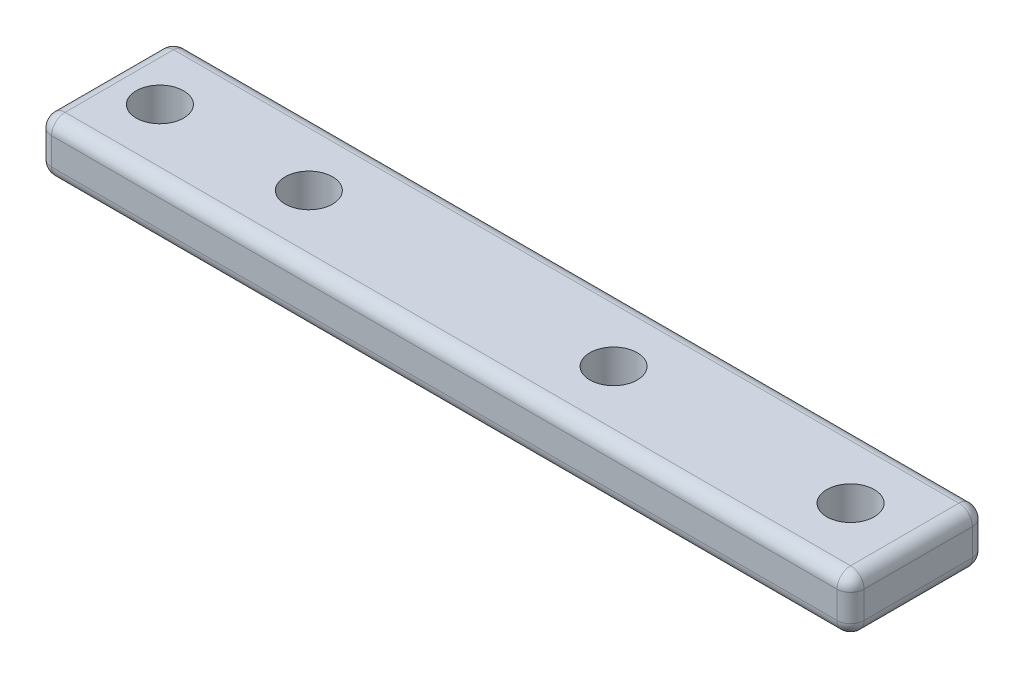
ISO-10303-21;
HEADER;
FILE_DESCRIPTION(('STEP AP214'),'2;1');
FILE_NAME('part.step','',(''),(''),'','','');
FILE_SCHEMA(('AUTOMOTIVE_DESIGN { 1 0 10303 214 1 1 1 1 }'));
ENDSEC;
DATA;
#1=APPLICATION_CONTEXT('core data for automotive mechanical design processes');
#2=APPLICATION_PROTOCOL_DEFINITION('international standard','automotive_design',2000,#1);
#3=PRODUCT_CONTEXT('',#1,'mechanical');
#4=PRODUCT('Part','Part','',(#3));
#5=PRODUCT_RELATED_PRODUCT_CATEGORY('part','',(#4));
#6=PRODUCT_DEFINITION_FORMATION('','',#4);
#7=PRODUCT_DEFINITION_CONTEXT('part definition',#1,'design');
#8=PRODUCT_DEFINITION('design','',#6,#7);
#9=PRODUCT_DEFINITION_SHAPE('','',#8);
#10=(LENGTH_UNIT() NAMED_UNIT(*) SI_UNIT(.MILLI.,.METRE.));
#11=(NAMED_UNIT(*) PLANE_ANGLE_UNIT() SI_UNIT($,.RADIAN.));
#12=(NAMED_UNIT(*) SI_UNIT($,.STERADIAN.) SOLID_ANGLE_UNIT());
#13=UNCERTAINTY_MEASURE_WITH_UNIT(LENGTH_MEASURE(1.E-05),#10,'distance_accuracy_value','');
#14=(GEOMETRIC_REPRESENTATION_CONTEXT(3) GLOBAL_UNCERTAINTY_ASSIGNED_CONTEXT((#13)) GLOBAL_UNIT_ASSIGNED_CONTEXT((#10,
#11,#12)) REPRESENTATION_CONTEXT('',''));
#15=CARTESIAN_POINT('',(0.,0.,0.));
#16=DIRECTION('',(0.,0.,1.));
#17=DIRECTION('',(1.,0.,0.));
#18=AXIS2_PLACEMENT_3D('',#15,#16,#17);
#19=CARTESIAN_POINT('',(30.,4.,-5.));
#20=DIRECTION('',(-1.,0.,0.));
#21=DIRECTION('',(0.,0.,1.));
#22=AXIS2_PLACEMENT_3D('',#19,#20,#21);
#23=PLANE('',#22);
#24=DIRECTION('',(0.,0.,-1.));
#25=VECTOR('',#24,1.);
#26=CARTESIAN_POINT('',(30.,1.,-5.));
#27=LINE('',#26,#25);
#28=CARTESIAN_POINT('',(30.,1.,4.));
#29=VERTEX_POINT('',#28);
#30=CARTESIAN_POINT('',(30.,1.,-4.));
#31=VERTEX_POINT('',#30);
#32=EDGE_CURVE('E178',#29,#31,#27,.T.);
#33=ORIENTED_EDGE('',*,*,#32,.T.);
#34=DIRECTION('',(0.,-1.,0.));
#35=VECTOR('',#34,1.);
#36=CARTESIAN_POINT('',(30.,4.,-4.));
#37=LINE('',#36,#35);
#38=CARTESIAN_POINT('',(30.,3.,-4.));
#39=VERTEX_POINT('',#38);
#40=EDGE_CURVE('E183',#31,#39,#37,.F.);
#41=ORIENTED_EDGE('',*,*,#40,.T.);
#42=DIRECTION('',(0.,0.,-1.));
#43=VECTOR('',#42,1.);
#44=CARTESIAN_POINT('',(30.,3.,5.));
#45=LINE('',#44,#43);
#46=CARTESIAN_POINT('',(30.,3.,4.));
#47=VERTEX_POINT('',#46);
#48=EDGE_CURVE('E180',#39,#47,#45,.F.);
#49=ORIENTED_EDGE('',*,*,#48,.T.);
#50=DIRECTION('',(0.,-1.,0.));
#51=VECTOR('',#50,1.);
#52=CARTESIAN_POINT('',(30.,4.,4.));
#53=LINE('',#52,#51);
#54=EDGE_CURVE('E176',#47,#29,#53,.T.);
#55=ORIENTED_EDGE('',*,*,#54,.T.);
#56=EDGE_LOOP('',(#33,#41,#49,#55));
#57=FACE_BOUND('',#56,.T.);
#58=ADVANCED_FACE('F39',(#57),#23,.F.);
#59=CARTESIAN_POINT('',(-30.,4.,-5.));
#60=DIRECTION('',(0.,0.,1.));
#61=DIRECTION('',(1.,0.,0.));
#62=AXIS2_PLACEMENT_3D('',#59,#60,#61);
#63=PLANE('',#62);
#64=DIRECTION('',(-1.,0.,0.));
#65=VECTOR('',#64,1.);
#66=CARTESIAN_POINT('',(30.,3.,-5.));
#67=LINE('',#66,#65);
#68=CARTESIAN_POINT('',(-29.,3.,-5.));
#69=VERTEX_POINT('',#68);
#70=CARTESIAN_POINT('',(29.,3.,-5.));
#71=VERTEX_POINT('',#70);
#72=EDGE_CURVE('E205',#69,#71,#67,.F.);
#73=ORIENTED_EDGE('',*,*,#72,.T.);
#74=DIRECTION('',(0.,-1.,0.));
#75=VECTOR('',#74,1.);
#76=CARTESIAN_POINT('',(29.,4.,-5.));
#77=LINE('',#76,#75);
#78=CARTESIAN_POINT('',(29.,1.,-5.));
#79=VERTEX_POINT('',#78);
#80=EDGE_CURVE('E207',#71,#79,#77,.T.);
#81=ORIENTED_EDGE('',*,*,#80,.T.);
#82=DIRECTION('',(-1.,0.,0.));
#83=VECTOR('',#82,1.);
#84=CARTESIAN_POINT('',(-30.,1.,-5.));
#85=LINE('',#84,#83);
#86=CARTESIAN_POINT('',(-29.,1.,-5.));
#87=VERTEX_POINT('',#86);
#88=EDGE_CURVE('E201',#79,#87,#85,.T.);
#89=ORIENTED_EDGE('',*,*,#88,.T.);
#90=DIRECTION('',(0.,-1.,0.));
#91=VECTOR('',#90,1.);
#92=CARTESIAN_POINT('',(-29.,4.,-5.));
#93=LINE('',#92,#91);
#94=EDGE_CURVE('E203',#87,#69,#93,.F.);
#95=ORIENTED_EDGE('',*,*,#94,.T.);
#96=EDGE_LOOP('',(#73,#81,#89,#95));
#97=FACE_BOUND('',#96,.T.);
#98=ADVANCED_FACE('F321',(#97),#63,.F.);
#99=CARTESIAN_POINT('',(-30.,4.,-5.));
#100=DIRECTION('',(1.,0.,0.));
#101=DIRECTION('',(0.,0.,-1.));
#102=AXIS2_PLACEMENT_3D('',#99,#100,#101);
#103=PLANE('',#102);
#104=DIRECTION('',(0.,0.,1.));
#105=VECTOR('',#104,1.);
#106=CARTESIAN_POINT('',(-30.,3.,-5.));
#107=LINE('',#106,#105);
#108=CARTESIAN_POINT('',(-30.,3.,4.));
#109=VERTEX_POINT('',#108);
#110=CARTESIAN_POINT('',(-30.,3.,-4.));
#111=VERTEX_POINT('',#110);
#112=EDGE_CURVE('E147',#109,#111,#107,.F.);
#113=ORIENTED_EDGE('',*,*,#112,.T.);
#114=DIRECTION('',(0.,-1.,0.));
#115=VECTOR('',#114,1.);
#116=CARTESIAN_POINT('',(-30.,4.,-4.));
#117=LINE('',#116,#115);
#118=CARTESIAN_POINT('',(-30.,1.,-4.));
#119=VERTEX_POINT('',#118);
#120=EDGE_CURVE('E199',#111,#119,#117,.T.);
#121=ORIENTED_EDGE('',*,*,#120,.T.);
#122=DIRECTION('',(0.,0.,1.));
#123=VECTOR('',#122,1.);
#124=CARTESIAN_POINT('',(-30.,1.,-5.));
#125=LINE('',#124,#123);
#126=CARTESIAN_POINT('',(-30.,1.,4.));
#127=VERTEX_POINT('',#126);
#128=EDGE_CURVE('E196',#119,#127,#125,.T.);
#129=ORIENTED_EDGE('',*,*,#128,.T.);
#130=DIRECTION('',(0.,-1.,0.));
#131=VECTOR('',#130,1.);
#132=CARTESIAN_POINT('',(-30.,4.,4.));
#133=LINE('',#132,#131);
#134=EDGE_CURVE('E194',#127,#109,#133,.F.);
#135=ORIENTED_EDGE('',*,*,#134,.T.);
#136=EDGE_LOOP('',(#113,#121,#129,#135));
#137=FACE_BOUND('',#136,.T.);
#138=ADVANCED_FACE('F328',(#137),#103,.F.);
#139=CARTESIAN_POINT('',(-30.,4.,5.));
#140=DIRECTION('',(0.,0.,-1.));
#141=DIRECTION('',(-1.,0.,0.));
#142=AXIS2_PLACEMENT_3D('',#139,#140,#141);
#143=PLANE('',#142);
#144=DIRECTION('',(1.,0.,0.));
#145=VECTOR('',#144,1.);
#146=CARTESIAN_POINT('',(-30.,3.,5.));
#147=LINE('',#146,#145);
#148=CARTESIAN_POINT('',(29.,3.,5.));
#149=VERTEX_POINT('',#148);
#150=CARTESIAN_POINT('',(-29.,3.,5.));
#151=VERTEX_POINT('',#150);
#152=EDGE_CURVE('E48',#149,#151,#147,.F.);
#153=ORIENTED_EDGE('',*,*,#152,.T.);
#154=DIRECTION('',(0.,-1.,0.));
#155=VECTOR('',#154,1.);
#156=CARTESIAN_POINT('',(-29.,4.,5.));
#157=LINE('',#156,#155);
#158=CARTESIAN_POINT('',(-29.,1.,5.));
#159=VERTEX_POINT('',#158);
#160=EDGE_CURVE('E11',#151,#159,#157,.T.);
#161=ORIENTED_EDGE('',*,*,#160,.T.);
#162=DIRECTION('',(1.,0.,0.));
#163=VECTOR('',#162,1.);
#164=CARTESIAN_POINT('',(-30.,1.,5.));
#165=LINE('',#164,#163);
#166=CARTESIAN_POINT('',(29.,1.,5.));
#167=VERTEX_POINT('',#166);
#168=EDGE_CURVE('E210',#159,#167,#165,.T.);
#169=ORIENTED_EDGE('',*,*,#168,.T.);
#170=DIRECTION('',(0.,-1.,0.));
#171=VECTOR('',#170,1.);
#172=CARTESIAN_POINT('',(29.,4.,5.));
#173=LINE('',#172,#171);
#174=EDGE_CURVE('E59',#167,#149,#173,.F.);
#175=ORIENTED_EDGE('',*,*,#174,.T.);
#176=EDGE_LOOP('',(#153,#161,#169,#175));
#177=FACE_BOUND('',#176,.T.);
#178=ADVANCED_FACE('F298',(#177),#143,.F.);
#179=CARTESIAN_POINT('',(0.,4.,0.));
#180=DIRECTION('',(0.,1.,0.));
#181=DIRECTION('',(0.,0.,1.));
#182=AXIS2_PLACEMENT_3D('',#179,#180,#181);
#183=PLANE('',#182);
#184=DIRECTION('',(0.,0.,-1.));
#185=VECTOR('',#184,1.);
#186=CARTESIAN_POINT('',(29.,4.,-5.));
#187=LINE('',#186,#185);
#188=CARTESIAN_POINT('',(29.,4.,4.));
#189=VERTEX_POINT('',#188);
#190=CARTESIAN_POINT('',(29.,4.,-4.));
#191=VERTEX_POINT('',#190);
#192=EDGE_CURVE('E139',#189,#191,#187,.T.);
#193=ORIENTED_EDGE('',*,*,#192,.T.);
#194=DIRECTION('',(-1.,0.,0.));
#195=VECTOR('',#194,1.);
#196=CARTESIAN_POINT('',(-30.,4.,-4.));
#197=LINE('',#196,#195);
#198=CARTESIAN_POINT('',(-29.,4.,-4.));
#199=VERTEX_POINT('',#198);
#200=EDGE_CURVE('E135',#191,#199,#197,.T.);
#201=ORIENTED_EDGE('',*,*,#200,.T.);
#202=DIRECTION('',(0.,0.,1.));
#203=VECTOR('',#202,1.);
#204=CARTESIAN_POINT('',(-29.,4.,5.));
#205=LINE('',#204,#203);
#206=CARTESIAN_POINT('',(-29.,4.,4.));
#207=VERTEX_POINT('',#206);
#208=EDGE_CURVE('E126',#199,#207,#205,.T.);
#209=ORIENTED_EDGE('',*,*,#208,.T.);
#210=DIRECTION('',(1.,0.,0.));
#211=VECTOR('',#210,1.);
#212=CARTESIAN_POINT('',(30.,4.,4.));
#213=LINE('',#212,#211);
#214=EDGE_CURVE('E132',#207,#189,#213,.T.);
#215=ORIENTED_EDGE('',*,*,#214,.T.);
#216=EDGE_LOOP('',(#193,#201,#209,#215));
#217=FACE_BOUND('',#216,.T.);
#218=CARTESIAN_POINT('',(-26.,4.,0.));
#219=DIRECTION('',(0.,1.,0.));
#220=DIRECTION('',(0.,0.,1.));
#221=AXIS2_PLACEMENT_3D('',#218,#219,#220);
#222=CIRCLE('',#221,1.75);
#223=CARTESIAN_POINT('',(-26.,4.,1.75));
#224=VERTEX_POINT('',#223);
#225=EDGE_CURVE('E168',#224,#224,#222,.T.);
#226=ORIENTED_EDGE('',*,*,#225,.F.);
#227=EDGE_LOOP('',(#226));
#228=FACE_BOUND('',#227,.T.);
#229=CARTESIAN_POINT('',(7.5,4.,0.));
#230=DIRECTION('',(0.,1.,0.));
#231=DIRECTION('',(0.,0.,1.));
#232=AXIS2_PLACEMENT_3D('',#229,#230,#231);
#233=CIRCLE('',#232,1.75);
#234=CARTESIAN_POINT('',(7.5,4.,1.75));
#235=VERTEX_POINT('',#234);
#236=EDGE_CURVE('E288',#235,#235,#233,.T.);
#237=ORIENTED_EDGE('',*,*,#236,.F.);
#238=EDGE_LOOP('',(#237));
#239=FACE_BOUND('',#238,.T.);
#240=CARTESIAN_POINT('',(25.,4.,0.));
#241=DIRECTION('',(0.,1.,0.));
#242=DIRECTION('',(0.,0.,1.));
#243=AXIS2_PLACEMENT_3D('',#240,#241,#242);
#244=CIRCLE('',#243,1.75);
#245=CARTESIAN_POINT('',(25.,4.,1.75));
#246=VERTEX_POINT('',#245);
#247=EDGE_CURVE('E280',#246,#246,#244,.T.);
#248=ORIENTED_EDGE('',*,*,#247,.F.);
#249=EDGE_LOOP('',(#248));
#250=FACE_BOUND('',#249,.T.);
#251=CARTESIAN_POINT('',(-15.,4.,0.));
#252=DIRECTION('',(0.,1.,0.));
#253=DIRECTION('',(0.,0.,1.));
#254=AXIS2_PLACEMENT_3D('',#251,#252,#253);
#255=CIRCLE('',#254,1.75);
#256=CARTESIAN_POINT('',(-15.,4.,1.75));
#257=VERTEX_POINT('',#256);
#258=EDGE_CURVE('E272',#257,#257,#255,.T.);
#259=ORIENTED_EDGE('',*,*,#258,.F.);
#260=EDGE_LOOP('',(#259));
#261=FACE_BOUND('',#260,.T.);
#262=ADVANCED_FACE('F129',(#217,#228,#239,#250,#261),#183,.T.);
#263=CARTESIAN_POINT('',(0.,0.,0.));
#264=DIRECTION('',(0.,1.,0.));
#265=DIRECTION('',(0.,0.,1.));
#266=AXIS2_PLACEMENT_3D('',#263,#264,#265);
#267=PLANE('',#266);
#268=DIRECTION('',(0.,0.,1.));
#269=VECTOR('',#268,1.);
#270=CARTESIAN_POINT('',(-29.,0.,0.));
#271=LINE('',#270,#269);
#272=CARTESIAN_POINT('',(-29.,0.,4.));
#273=VERTEX_POINT('',#272);
#274=CARTESIAN_POINT('',(-29.,0.,-4.));
#275=VERTEX_POINT('',#274);
#276=EDGE_CURVE('E187',#273,#275,#271,.F.);
#277=ORIENTED_EDGE('',*,*,#276,.T.);
#278=DIRECTION('',(-1.,0.,0.));
#279=VECTOR('',#278,1.);
#280=CARTESIAN_POINT('',(0.,0.,-4.));
#281=LINE('',#280,#279);
#282=CARTESIAN_POINT('',(29.,0.,-4.));
#283=VERTEX_POINT('',#282);
#284=EDGE_CURVE('E192',#275,#283,#281,.F.);
#285=ORIENTED_EDGE('',*,*,#284,.T.);
#286=DIRECTION('',(0.,0.,-1.));
#287=VECTOR('',#286,1.);
#288=CARTESIAN_POINT('',(29.,0.,0.));
#289=LINE('',#288,#287);
#290=CARTESIAN_POINT('',(29.,0.,4.));
#291=VERTEX_POINT('',#290);
#292=EDGE_CURVE('E189',#283,#291,#289,.F.);
#293=ORIENTED_EDGE('',*,*,#292,.T.);
#294=DIRECTION('',(1.,0.,0.));
#295=VECTOR('',#294,1.);
#296=CARTESIAN_POINT('',(0.,0.,4.));
#297=LINE('',#296,#295);
#298=EDGE_CURVE('E185',#291,#273,#297,.F.);
#299=ORIENTED_EDGE('',*,*,#298,.T.);
#300=EDGE_LOOP('',(#277,#285,#293,#299));
#301=FACE_BOUND('',#300,.T.);
#302=CARTESIAN_POINT('',(-26.,0.,0.));
#303=DIRECTION('',(0.,1.,0.));
#304=DIRECTION('',(0.,0.,1.));
#305=AXIS2_PLACEMENT_3D('',#302,#303,#304);
#306=CIRCLE('',#305,1.75);
#307=CARTESIAN_POINT('',(-26.,0.,1.75));
#308=VERTEX_POINT('',#307);
#309=EDGE_CURVE('E165',#308,#308,#306,.T.);
#310=ORIENTED_EDGE('',*,*,#309,.T.);
#311=EDGE_LOOP('',(#310));
#312=FACE_BOUND('',#311,.T.);
#313=CARTESIAN_POINT('',(7.5,0.,0.));
#314=DIRECTION('',(0.,1.,0.));
#315=DIRECTION('',(0.,0.,1.));
#316=AXIS2_PLACEMENT_3D('',#313,#314,#315);
#317=CIRCLE('',#316,1.75);
#318=CARTESIAN_POINT('',(7.5,0.,1.75));
#319=VERTEX_POINT('',#318);
#320=EDGE_CURVE('E285',#319,#319,#317,.T.);
#321=ORIENTED_EDGE('',*,*,#320,.T.);
#322=EDGE_LOOP('',(#321));
#323=FACE_BOUND('',#322,.T.);
#324=CARTESIAN_POINT('',(25.,0.,0.));
#325=DIRECTION('',(0.,1.,0.));
#326=DIRECTION('',(0.,0.,1.));
#327=AXIS2_PLACEMENT_3D('',#324,#325,#326);
#328=CIRCLE('',#327,1.75);
#329=CARTESIAN_POINT('',(25.,0.,1.75));
#330=VERTEX_POINT('',#329);
#331=EDGE_CURVE('E276',#330,#330,#328,.T.);
#332=ORIENTED_EDGE('',*,*,#331,.T.);
#333=EDGE_LOOP('',(#332));
#334=FACE_BOUND('',#333,.T.);
#335=CARTESIAN_POINT('',(-15.,0.,0.));
#336=DIRECTION('',(0.,1.,0.));
#337=DIRECTION('',(0.,0.,1.));
#338=AXIS2_PLACEMENT_3D('',#335,#336,#337);
#339=CIRCLE('',#338,1.75);
#340=CARTESIAN_POINT('',(-15.,0.,1.75));
#341=VERTEX_POINT('',#340);
#342=EDGE_CURVE('E171',#341,#341,#339,.T.);
#343=ORIENTED_EDGE('',*,*,#342,.T.);
#344=EDGE_LOOP('',(#343));
#345=FACE_BOUND('',#344,.T.);
#346=ADVANCED_FACE('F297',(#301,#312,#323,#334,#345),#267,.F.);
#347=CARTESIAN_POINT('',(-15.,0.,0.));
#348=DIRECTION('',(0.,1.,0.));
#349=DIRECTION('',(0.,0.,1.));
#350=AXIS2_PLACEMENT_3D('',#347,#348,#349);
#351=CYLINDRICAL_SURFACE('',#350,1.75);
#352=ORIENTED_EDGE('',*,*,#342,.F.);
#353=EDGE_LOOP('',(#352));
#354=FACE_BOUND('',#353,.T.);
#355=ORIENTED_EDGE('',*,*,#258,.T.);
#356=EDGE_LOOP('',(#355));
#357=FACE_BOUND('',#356,.T.);
#358=ADVANCED_FACE('F308',(#354,#357),#351,.F.);
#359=CARTESIAN_POINT('',(25.,0.,0.));
#360=DIRECTION('',(0.,1.,0.));
#361=DIRECTION('',(0.,0.,1.));
#362=AXIS2_PLACEMENT_3D('',#359,#360,#361);
#363=CYLINDRICAL_SURFACE('',#362,1.75);
#364=ORIENTED_EDGE('',*,*,#331,.F.);
#365=EDGE_LOOP('',(#364));
#366=FACE_BOUND('',#365,.T.);
#367=ORIENTED_EDGE('',*,*,#247,.T.);
#368=EDGE_LOOP('',(#367));
#369=FACE_BOUND('',#368,.T.);
#370=ADVANCED_FACE('F305',(#366,#369),#363,.F.);
#371=CARTESIAN_POINT('',(7.5,0.,0.));
#372=DIRECTION('',(0.,1.,0.));
#373=DIRECTION('',(0.,0.,1.));
#374=AXIS2_PLACEMENT_3D('',#371,#372,#373);
#375=CYLINDRICAL_SURFACE('',#374,1.75);
#376=ORIENTED_EDGE('',*,*,#320,.F.);
#377=EDGE_LOOP('',(#376));
#378=FACE_BOUND('',#377,.T.);
#379=ORIENTED_EDGE('',*,*,#236,.T.);
#380=EDGE_LOOP('',(#379));
#381=FACE_BOUND('',#380,.T.);
#382=ADVANCED_FACE('F307',(#378,#381),#375,.F.);
#383=CARTESIAN_POINT('',(-26.,0.,0.));
#384=DIRECTION('',(0.,1.,0.));
#385=DIRECTION('',(0.,0.,1.));
#386=AXIS2_PLACEMENT_3D('',#383,#384,#385);
#387=CYLINDRICAL_SURFACE('',#386,1.75);
#388=ORIENTED_EDGE('',*,*,#309,.F.);
#389=EDGE_LOOP('',(#388));
#390=FACE_BOUND('',#389,.T.);
#391=ORIENTED_EDGE('',*,*,#225,.T.);
#392=EDGE_LOOP('',(#391));
#393=FACE_BOUND('',#392,.T.);
#394=ADVANCED_FACE('F294',(#390,#393),#387,.F.);
#395=CARTESIAN_POINT('',(-29.,1.,-5.));
#396=DIRECTION('',(0.,0.,1.));
#397=DIRECTION('',(1.,0.,0.));
#398=AXIS2_PLACEMENT_3D('',#395,#396,#397);
#399=CYLINDRICAL_SURFACE('',#398,1.);
#400=CARTESIAN_POINT('',(-29.,1.,4.));
#401=DIRECTION('',(0.,0.,1.));
#402=DIRECTION('',(1.,0.,0.));
#403=AXIS2_PLACEMENT_3D('',#400,#401,#402);
#404=CIRCLE('',#403,1.);
#405=EDGE_CURVE('E43',#127,#273,#404,.T.);
#406=ORIENTED_EDGE('',*,*,#405,.F.);
#407=ORIENTED_EDGE('',*,*,#128,.F.);
#408=CARTESIAN_POINT('',(-29.,1.,-4.));
#409=DIRECTION('',(0.,0.,-1.));
#410=DIRECTION('',(-1.,0.,0.));
#411=AXIS2_PLACEMENT_3D('',#408,#409,#410);
#412=CIRCLE('',#411,1.);
#413=EDGE_CURVE('E260',#275,#119,#412,.T.);
#414=ORIENTED_EDGE('',*,*,#413,.F.);
#415=ORIENTED_EDGE('',*,*,#276,.F.);
#416=EDGE_LOOP('',(#406,#407,#414,#415));
#417=FACE_BOUND('',#416,.T.);
#418=ADVANCED_FACE('F41',(#417),#399,.T.);
#419=CARTESIAN_POINT('',(-29.,1.,4.));
#420=DIRECTION('',(0.,-1.,0.));
#421=DIRECTION('',(0.,0.,-1.));
#422=AXIS2_PLACEMENT_3D('',#419,#420,#421);
#423=SPHERICAL_SURFACE('',#422,1.);
#424=CARTESIAN_POINT('',(-29.,1.,4.));
#425=DIRECTION('',(0.,-1.,0.));
#426=DIRECTION('',(0.,0.,-1.));
#427=AXIS2_PLACEMENT_3D('',#424,#425,#426);
#428=CIRCLE('',#427,1.);
#429=EDGE_CURVE('E255',#127,#159,#428,.F.);
#430=ORIENTED_EDGE('',*,*,#429,.F.);
#431=ORIENTED_EDGE('',*,*,#405,.T.);
#432=CARTESIAN_POINT('',(-29.,1.,4.));
#433=DIRECTION('',(-1.,0.,0.));
#434=DIRECTION('',(0.,0.,1.));
#435=AXIS2_PLACEMENT_3D('',#432,#433,#434);
#436=CIRCLE('',#435,1.);
#437=EDGE_CURVE('E258',#159,#273,#436,.F.);
#438=ORIENTED_EDGE('',*,*,#437,.F.);
#439=EDGE_LOOP('',(#430,#431,#438));
#440=FACE_BOUND('',#439,.T.);
#441=ADVANCED_FACE('F397',(#440),#423,.T.);
#442=CARTESIAN_POINT('',(-29.,1.,-4.));
#443=DIRECTION('',(-1.,0.,0.));
#444=DIRECTION('',(0.,0.,1.));
#445=AXIS2_PLACEMENT_3D('',#442,#443,#444);
#446=SPHERICAL_SURFACE('',#445,1.);
#447=CARTESIAN_POINT('',(-29.,1.,-4.));
#448=DIRECTION('',(-1.,0.,0.));
#449=DIRECTION('',(0.,0.,1.));
#450=AXIS2_PLACEMENT_3D('',#447,#448,#449);
#451=CIRCLE('',#450,1.);
#452=EDGE_CURVE('E249',#275,#87,#451,.F.);
#453=ORIENTED_EDGE('',*,*,#452,.F.);
#454=ORIENTED_EDGE('',*,*,#413,.T.);
#455=CARTESIAN_POINT('',(-29.,1.,-4.));
#456=DIRECTION('',(0.,-1.,0.));
#457=DIRECTION('',(0.,0.,-1.));
#458=AXIS2_PLACEMENT_3D('',#455,#456,#457);
#459=CIRCLE('',#458,1.);
#460=EDGE_CURVE('E252',#87,#119,#459,.F.);
#461=ORIENTED_EDGE('',*,*,#460,.F.);
#462=EDGE_LOOP('',(#453,#454,#461));
#463=FACE_BOUND('',#462,.T.);
#464=ADVANCED_FACE('F394',(#463),#446,.T.);
#465=CARTESIAN_POINT('',(-30.,1.,4.));
#466=DIRECTION('',(1.,0.,0.));
#467=DIRECTION('',(0.,0.,-1.));
#468=AXIS2_PLACEMENT_3D('',#465,#466,#467);
#469=CYLINDRICAL_SURFACE('',#468,1.);
#470=ORIENTED_EDGE('',*,*,#437,.T.);
#471=ORIENTED_EDGE('',*,*,#298,.F.);
#472=CARTESIAN_POINT('',(29.,1.,4.));
#473=DIRECTION('',(1.,0.,0.));
#474=DIRECTION('',(0.,0.,-1.));
#475=AXIS2_PLACEMENT_3D('',#472,#473,#474);
#476=CIRCLE('',#475,1.);
#477=EDGE_CURVE('E244',#167,#291,#476,.T.);
#478=ORIENTED_EDGE('',*,*,#477,.F.);
#479=ORIENTED_EDGE('',*,*,#168,.F.);
#480=EDGE_LOOP('',(#470,#471,#478,#479));
#481=FACE_BOUND('',#480,.T.);
#482=ADVANCED_FACE('F390',(#481),#469,.T.);
#483=CARTESIAN_POINT('',(-29.,4.,4.));
#484=DIRECTION('',(0.,-1.,0.));
#485=DIRECTION('',(0.,0.,-1.));
#486=AXIS2_PLACEMENT_3D('',#483,#484,#485);
#487=CYLINDRICAL_SURFACE('',#486,1.);
#488=ORIENTED_EDGE('',*,*,#429,.T.);
#489=ORIENTED_EDGE('',*,*,#160,.F.);
#490=CARTESIAN_POINT('',(-29.,3.,4.));
#491=DIRECTION('',(0.,1.,0.));
#492=DIRECTION('',(0.,0.,1.));
#493=AXIS2_PLACEMENT_3D('',#490,#491,#492);
#494=CIRCLE('',#493,1.);
#495=EDGE_CURVE('E151',#109,#151,#494,.T.);
#496=ORIENTED_EDGE('',*,*,#495,.F.);
#497=ORIENTED_EDGE('',*,*,#134,.F.);
#498=EDGE_LOOP('',(#488,#489,#496,#497));
#499=FACE_BOUND('',#498,.T.);
#500=ADVANCED_FACE('F387',(#499),#487,.T.);
#501=CARTESIAN_POINT('',(-29.,3.,0.));
#502=DIRECTION('',(0.,0.,-1.));
#503=DIRECTION('',(-1.,0.,0.));
#504=AXIS2_PLACEMENT_3D('',#501,#502,#503);
#505=CYLINDRICAL_SURFACE('',#504,1.);
#506=CARTESIAN_POINT('',(-29.,3.,-4.));
#507=DIRECTION('',(0.,0.,-1.));
#508=DIRECTION('',(-1.,0.,0.));
#509=AXIS2_PLACEMENT_3D('',#506,#507,#508);
#510=CIRCLE('',#509,1.);
#511=EDGE_CURVE('E152',#111,#199,#510,.T.);
#512=ORIENTED_EDGE('',*,*,#511,.F.);
#513=ORIENTED_EDGE('',*,*,#112,.F.);
#514=CARTESIAN_POINT('',(-29.,3.,4.));
#515=DIRECTION('',(0.,0.,1.));
#516=DIRECTION('',(1.,0.,0.));
#517=AXIS2_PLACEMENT_3D('',#514,#515,#516);
#518=CIRCLE('',#517,1.);
#519=EDGE_CURVE('E143',#207,#109,#518,.T.);
#520=ORIENTED_EDGE('',*,*,#519,.F.);
#521=ORIENTED_EDGE('',*,*,#208,.F.);
#522=EDGE_LOOP('',(#512,#513,#520,#521));
#523=FACE_BOUND('',#522,.T.);
#524=ADVANCED_FACE('F145',(#523),#505,.T.);
#525=CARTESIAN_POINT('',(-29.,4.,-4.));
#526=DIRECTION('',(0.,-1.,0.));
#527=DIRECTION('',(0.,0.,-1.));
#528=AXIS2_PLACEMENT_3D('',#525,#526,#527);
#529=CYLINDRICAL_SURFACE('',#528,1.);
#530=ORIENTED_EDGE('',*,*,#460,.T.);
#531=ORIENTED_EDGE('',*,*,#120,.F.);
#532=CARTESIAN_POINT('',(-29.,3.,-4.));
#533=DIRECTION('',(0.,1.,0.));
#534=DIRECTION('',(0.,0.,1.));
#535=AXIS2_PLACEMENT_3D('',#532,#533,#534);
#536=CIRCLE('',#535,1.);
#537=EDGE_CURVE('E240',#69,#111,#536,.T.);
#538=ORIENTED_EDGE('',*,*,#537,.F.);
#539=ORIENTED_EDGE('',*,*,#94,.F.);
#540=EDGE_LOOP('',(#530,#531,#538,#539));
#541=FACE_BOUND('',#540,.T.);
#542=ADVANCED_FACE('F380',(#541),#529,.T.);
#543=CARTESIAN_POINT('',(-30.,1.,-4.));
#544=DIRECTION('',(-1.,0.,0.));
#545=DIRECTION('',(0.,0.,1.));
#546=AXIS2_PLACEMENT_3D('',#543,#544,#545);
#547=CYLINDRICAL_SURFACE('',#546,1.);
#548=ORIENTED_EDGE('',*,*,#452,.T.);
#549=ORIENTED_EDGE('',*,*,#88,.F.);
#550=CARTESIAN_POINT('',(29.,1.,-4.));
#551=DIRECTION('',(1.,0.,0.));
#552=DIRECTION('',(0.,0.,-1.));
#553=AXIS2_PLACEMENT_3D('',#550,#551,#552);
#554=CIRCLE('',#553,1.);
#555=EDGE_CURVE('E237',#283,#79,#554,.T.);
#556=ORIENTED_EDGE('',*,*,#555,.F.);
#557=ORIENTED_EDGE('',*,*,#284,.F.);
#558=EDGE_LOOP('',(#548,#549,#556,#557));
#559=FACE_BOUND('',#558,.T.);
#560=ADVANCED_FACE('F376',(#559),#547,.T.);
#561=CARTESIAN_POINT('',(29.,1.,-5.));
#562=DIRECTION('',(0.,0.,-1.));
#563=DIRECTION('',(-1.,0.,0.));
#564=AXIS2_PLACEMENT_3D('',#561,#562,#563);
#565=CYLINDRICAL_SURFACE('',#564,1.);
#566=CARTESIAN_POINT('',(29.,1.,4.));
#567=DIRECTION('',(0.,0.,1.));
#568=DIRECTION('',(1.,0.,0.));
#569=AXIS2_PLACEMENT_3D('',#566,#567,#568);
#570=CIRCLE('',#569,1.);
#571=EDGE_CURVE('E246',#291,#29,#570,.T.);
#572=ORIENTED_EDGE('',*,*,#571,.F.);
#573=ORIENTED_EDGE('',*,*,#292,.F.);
#574=CARTESIAN_POINT('',(29.,1.,-4.));
#575=DIRECTION('',(0.,0.,-1.));
#576=DIRECTION('',(-1.,0.,0.));
#577=AXIS2_PLACEMENT_3D('',#574,#575,#576);
#578=CIRCLE('',#577,1.);
#579=EDGE_CURVE('E234',#31,#283,#578,.T.);
#580=ORIENTED_EDGE('',*,*,#579,.F.);
#581=ORIENTED_EDGE('',*,*,#32,.F.);
#582=EDGE_LOOP('',(#572,#573,#580,#581));
#583=FACE_BOUND('',#582,.T.);
#584=ADVANCED_FACE('F372',(#583),#565,.T.);
#585=CARTESIAN_POINT('',(29.,1.,4.));
#586=DIRECTION('',(0.,-1.,0.));
#587=DIRECTION('',(0.,0.,-1.));
#588=AXIS2_PLACEMENT_3D('',#585,#586,#587);
#589=SPHERICAL_SURFACE('',#588,1.);
#590=ORIENTED_EDGE('',*,*,#477,.T.);
#591=ORIENTED_EDGE('',*,*,#571,.T.);
#592=CARTESIAN_POINT('',(29.,1.,4.));
#593=DIRECTION('',(0.,-1.,0.));
#594=DIRECTION('',(0.,0.,-1.));
#595=AXIS2_PLACEMENT_3D('',#592,#593,#594);
#596=CIRCLE('',#595,1.);
#597=EDGE_CURVE('E158',#167,#29,#596,.F.);
#598=ORIENTED_EDGE('',*,*,#597,.F.);
#599=EDGE_LOOP('',(#590,#591,#598));
#600=FACE_BOUND('',#599,.T.);
#601=ADVANCED_FACE('F369',(#600),#589,.T.);
#602=CARTESIAN_POINT('',(-29.,3.,4.));
#603=DIRECTION('',(-1.,0.,0.));
#604=DIRECTION('',(0.,0.,1.));
#605=AXIS2_PLACEMENT_3D('',#602,#603,#604);
#606=SPHERICAL_SURFACE('',#605,1.);
#607=ORIENTED_EDGE('',*,*,#519,.T.);
#608=ORIENTED_EDGE('',*,*,#495,.T.);
#609=CARTESIAN_POINT('',(-29.,3.,4.));
#610=DIRECTION('',(-1.,0.,0.));
#611=DIRECTION('',(0.,0.,1.));
#612=AXIS2_PLACEMENT_3D('',#609,#610,#611);
#613=CIRCLE('',#612,1.);
#614=EDGE_CURVE('E155',#207,#151,#613,.F.);
#615=ORIENTED_EDGE('',*,*,#614,.F.);
#616=EDGE_LOOP('',(#607,#608,#615));
#617=FACE_BOUND('',#616,.T.);
#618=ADVANCED_FACE('F156',(#617),#606,.T.);
#619=CARTESIAN_POINT('',(-29.,3.,-4.));
#620=DIRECTION('',(-1.,0.,0.));
#621=DIRECTION('',(0.,0.,1.));
#622=AXIS2_PLACEMENT_3D('',#619,#620,#621);
#623=SPHERICAL_SURFACE('',#622,1.);
#624=ORIENTED_EDGE('',*,*,#537,.T.);
#625=ORIENTED_EDGE('',*,*,#511,.T.);
#626=CARTESIAN_POINT('',(-29.,3.,-4.));
#627=DIRECTION('',(-1.,0.,0.));
#628=DIRECTION('',(0.,0.,1.));
#629=AXIS2_PLACEMENT_3D('',#626,#627,#628);
#630=CIRCLE('',#629,1.);
#631=EDGE_CURVE('E159',#69,#199,#630,.F.);
#632=ORIENTED_EDGE('',*,*,#631,.F.);
#633=EDGE_LOOP('',(#624,#625,#632));
#634=FACE_BOUND('',#633,.T.);
#635=ADVANCED_FACE('F362',(#634),#623,.T.);
#636=CARTESIAN_POINT('',(29.,1.,-4.));
#637=DIRECTION('',(0.,-1.,0.));
#638=DIRECTION('',(0.,0.,-1.));
#639=AXIS2_PLACEMENT_3D('',#636,#637,#638);
#640=SPHERICAL_SURFACE('',#639,1.);
#641=ORIENTED_EDGE('',*,*,#579,.T.);
#642=ORIENTED_EDGE('',*,*,#555,.T.);
#643=CARTESIAN_POINT('',(29.,1.,-4.));
#644=DIRECTION('',(0.,-1.,0.));
#645=DIRECTION('',(0.,0.,-1.));
#646=AXIS2_PLACEMENT_3D('',#643,#644,#645);
#647=CIRCLE('',#646,1.);
#648=EDGE_CURVE('E228',#31,#79,#647,.F.);
#649=ORIENTED_EDGE('',*,*,#648,.F.);
#650=EDGE_LOOP('',(#641,#642,#649));
#651=FACE_BOUND('',#650,.T.);
#652=ADVANCED_FACE('F358',(#651),#640,.T.);
#653=CARTESIAN_POINT('',(29.,4.,4.));
#654=DIRECTION('',(0.,-1.,0.));
#655=DIRECTION('',(0.,0.,-1.));
#656=AXIS2_PLACEMENT_3D('',#653,#654,#655);
#657=CYLINDRICAL_SURFACE('',#656,1.);
#658=ORIENTED_EDGE('',*,*,#597,.T.);
#659=ORIENTED_EDGE('',*,*,#54,.F.);
#660=CARTESIAN_POINT('',(29.,3.,4.));
#661=DIRECTION('',(0.,1.,0.));
#662=DIRECTION('',(0.,0.,1.));
#663=AXIS2_PLACEMENT_3D('',#660,#661,#662);
#664=CIRCLE('',#663,1.);
#665=EDGE_CURVE('E225',#149,#47,#664,.T.);
#666=ORIENTED_EDGE('',*,*,#665,.F.);
#667=ORIENTED_EDGE('',*,*,#174,.F.);
#668=EDGE_LOOP('',(#658,#659,#666,#667));
#669=FACE_BOUND('',#668,.T.);
#670=ADVANCED_FACE('F355',(#669),#657,.T.);
#671=CARTESIAN_POINT('',(0.,3.,4.));
#672=DIRECTION('',(-1.,0.,0.));
#673=DIRECTION('',(0.,0.,1.));
#674=AXIS2_PLACEMENT_3D('',#671,#672,#673);
#675=CYLINDRICAL_SURFACE('',#674,1.);
#676=ORIENTED_EDGE('',*,*,#614,.T.);
#677=ORIENTED_EDGE('',*,*,#152,.F.);
#678=CARTESIAN_POINT('',(29.,3.,4.));
#679=DIRECTION('',(1.,0.,0.));
#680=DIRECTION('',(0.,0.,-1.));
#681=AXIS2_PLACEMENT_3D('',#678,#679,#680);
#682=CIRCLE('',#681,1.);
#683=EDGE_CURVE('E163',#189,#149,#682,.T.);
#684=ORIENTED_EDGE('',*,*,#683,.F.);
#685=ORIENTED_EDGE('',*,*,#214,.F.);
#686=EDGE_LOOP('',(#676,#677,#684,#685));
#687=FACE_BOUND('',#686,.T.);
#688=ADVANCED_FACE('F161',(#687),#675,.T.);
#689=CARTESIAN_POINT('',(0.,3.,-4.));
#690=DIRECTION('',(1.,0.,0.));
#691=DIRECTION('',(0.,0.,-1.));
#692=AXIS2_PLACEMENT_3D('',#689,#690,#691);
#693=CYLINDRICAL_SURFACE('',#692,1.);
#694=ORIENTED_EDGE('',*,*,#631,.T.);
#695=ORIENTED_EDGE('',*,*,#200,.F.);
#696=CARTESIAN_POINT('',(29.,3.,-4.));
#697=DIRECTION('',(1.,0.,0.));
#698=DIRECTION('',(0.,1.,0.));
#699=AXIS2_PLACEMENT_3D('',#696,#697,#698);
#700=CIRCLE('',#699,1.);
#701=EDGE_CURVE('E221',#71,#191,#700,.T.);
#702=ORIENTED_EDGE('',*,*,#701,.F.);
#703=ORIENTED_EDGE('',*,*,#72,.F.);
#704=EDGE_LOOP('',(#694,#695,#702,#703));
#705=FACE_BOUND('',#704,.T.);
#706=ADVANCED_FACE('F348',(#705),#693,.T.);
#707=CARTESIAN_POINT('',(29.,4.,-4.));
#708=DIRECTION('',(0.,-1.,0.));
#709=DIRECTION('',(0.,0.,-1.));
#710=AXIS2_PLACEMENT_3D('',#707,#708,#709);
#711=CYLINDRICAL_SURFACE('',#710,1.);
#712=ORIENTED_EDGE('',*,*,#648,.T.);
#713=ORIENTED_EDGE('',*,*,#80,.F.);
#714=CARTESIAN_POINT('',(29.,3.,-4.));
#715=DIRECTION('',(0.,1.,0.));
#716=DIRECTION('',(0.,0.,1.));
#717=AXIS2_PLACEMENT_3D('',#714,#715,#716);
#718=CIRCLE('',#717,1.);
#719=EDGE_CURVE('E218',#39,#71,#718,.T.);
#720=ORIENTED_EDGE('',*,*,#719,.F.);
#721=ORIENTED_EDGE('',*,*,#40,.F.);
#722=EDGE_LOOP('',(#712,#713,#720,#721));
#723=FACE_BOUND('',#722,.T.);
#724=ADVANCED_FACE('F344',(#723),#711,.T.);
#725=CARTESIAN_POINT('',(29.,3.,4.));
#726=DIRECTION('',(0.,0.,1.));
#727=DIRECTION('',(1.,0.,0.));
#728=AXIS2_PLACEMENT_3D('',#725,#726,#727);
#729=SPHERICAL_SURFACE('',#728,1.);
#730=ORIENTED_EDGE('',*,*,#683,.T.);
#731=ORIENTED_EDGE('',*,*,#665,.T.);
#732=CARTESIAN_POINT('',(29.,3.,4.));
#733=DIRECTION('',(0.,0.,1.));
#734=DIRECTION('',(0.,-1.,0.));
#735=AXIS2_PLACEMENT_3D('',#732,#733,#734);
#736=CIRCLE('',#735,1.);
#737=EDGE_CURVE('E216',#189,#47,#736,.F.);
#738=ORIENTED_EDGE('',*,*,#737,.F.);
#739=EDGE_LOOP('',(#730,#731,#738));
#740=FACE_BOUND('',#739,.T.);
#741=ADVANCED_FACE('F340',(#740),#729,.T.);
#742=CARTESIAN_POINT('',(29.,3.,-4.));
#743=DIRECTION('',(0.,0.,-1.));
#744=DIRECTION('',(-1.,0.,0.));
#745=AXIS2_PLACEMENT_3D('',#742,#743,#744);
#746=SPHERICAL_SURFACE('',#745,1.);
#747=ORIENTED_EDGE('',*,*,#719,.T.);
#748=ORIENTED_EDGE('',*,*,#701,.T.);
#749=CARTESIAN_POINT('',(29.,3.,-4.));
#750=DIRECTION('',(0.,0.,-1.));
#751=DIRECTION('',(-1.,0.,0.));
#752=AXIS2_PLACEMENT_3D('',#749,#750,#751);
#753=CIRCLE('',#752,1.);
#754=EDGE_CURVE('E214',#39,#191,#753,.F.);
#755=ORIENTED_EDGE('',*,*,#754,.F.);
#756=EDGE_LOOP('',(#747,#748,#755));
#757=FACE_BOUND('',#756,.T.);
#758=ADVANCED_FACE('F336',(#757),#746,.T.);
#759=CARTESIAN_POINT('',(29.,3.,0.));
#760=DIRECTION('',(0.,0.,1.));
#761=DIRECTION('',(1.,0.,0.));
#762=AXIS2_PLACEMENT_3D('',#759,#760,#761);
#763=CYLINDRICAL_SURFACE('',#762,1.);
#764=ORIENTED_EDGE('',*,*,#737,.T.);
#765=ORIENTED_EDGE('',*,*,#48,.F.);
#766=ORIENTED_EDGE('',*,*,#754,.T.);
#767=ORIENTED_EDGE('',*,*,#192,.F.);
#768=EDGE_LOOP('',(#764,#765,#766,#767));
#769=FACE_BOUND('',#768,.T.);
#770=ADVANCED_FACE('F333',(#769),#763,.T.);
#771=CLOSED_SHELL('',(#58,#98,#138,#178,#262,#346,#358,#370,#382,#394,#418,#441,#464,#482,#500,
#524,#542,#560,#584,#601,#618,#635,#652,#670,#688,#706,#724,#741,#758,#770));
#772=MANIFOLD_SOLID_BREP('B2',#771);
#773=ADVANCED_BREP_SHAPE_REPRESENTATION('',(#18,#772),#14);
#774=SHAPE_DEFINITION_REPRESENTATION(#9,#773);
ENDSEC;
END-ISO-10303-21;
